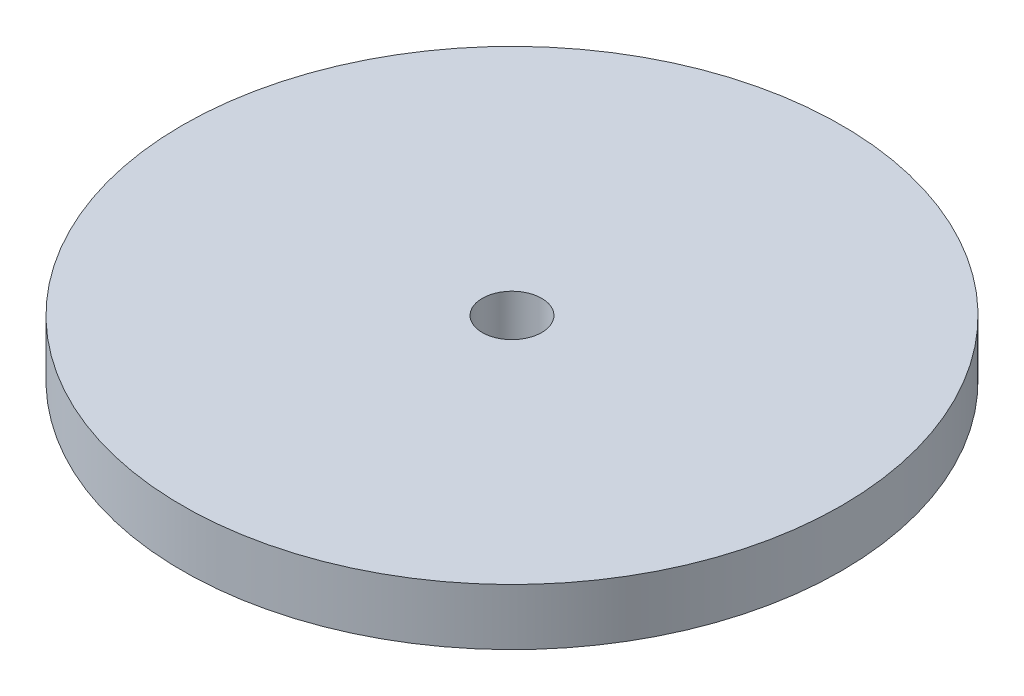
ISO-10303-21;
HEADER;
FILE_DESCRIPTION(('STEP AP214'),'2;1');
FILE_NAME('part.step','',(''),(''),'','','');
FILE_SCHEMA(('AUTOMOTIVE_DESIGN { 1 0 10303 214 1 1 1 1 }'));
ENDSEC;
DATA;
#1=APPLICATION_CONTEXT('core data for automotive mechanical design processes');
#2=APPLICATION_PROTOCOL_DEFINITION('international standard','automotive_design',2000,#1);
#3=PRODUCT_CONTEXT('',#1,'mechanical');
#4=PRODUCT('Part','Part','',(#3));
#5=PRODUCT_RELATED_PRODUCT_CATEGORY('part','',(#4));
#6=PRODUCT_DEFINITION_FORMATION('','',#4);
#7=PRODUCT_DEFINITION_CONTEXT('part definition',#1,'design');
#8=PRODUCT_DEFINITION('design','',#6,#7);
#9=PRODUCT_DEFINITION_SHAPE('','',#8);
#10=(LENGTH_UNIT() NAMED_UNIT(*) SI_UNIT(.MILLI.,.METRE.));
#11=(NAMED_UNIT(*) PLANE_ANGLE_UNIT() SI_UNIT($,.RADIAN.));
#12=(NAMED_UNIT(*) SI_UNIT($,.STERADIAN.) SOLID_ANGLE_UNIT());
#13=UNCERTAINTY_MEASURE_WITH_UNIT(LENGTH_MEASURE(1.E-05),#10,'distance_accuracy_value','');
#14=(GEOMETRIC_REPRESENTATION_CONTEXT(3) GLOBAL_UNCERTAINTY_ASSIGNED_CONTEXT((#13)) GLOBAL_UNIT_ASSIGNED_CONTEXT((#10,
#11,#12)) REPRESENTATION_CONTEXT('',''));
#15=CARTESIAN_POINT('',(0.,0.,0.));
#16=DIRECTION('',(0.,0.,1.));
#17=DIRECTION('',(1.,0.,0.));
#18=AXIS2_PLACEMENT_3D('',#15,#16,#17);
#19=CARTESIAN_POINT('',(-43.,817.,-1.62382802516847E-13));
#20=DIRECTION('',(0.,1.,0.));
#21=DIRECTION('',(-1.,0.,0.));
#22=AXIS2_PLACEMENT_3D('',#19,#20,#21);
#23=PLANE('',#22);
#24=CARTESIAN_POINT('',(-43.,817.,-1.68995676827488E-13));
#25=DIRECTION('',(0.,1.,0.));
#26=DIRECTION('',(-1.,0.,0.));
#27=AXIS2_PLACEMENT_3D('',#24,#25,#26);
#28=CIRCLE('',#27,10.);
#29=CARTESIAN_POINT('',(-53.,817.,-1.68995676827488E-13));
#30=VERTEX_POINT('',#29);
#31=EDGE_CURVE('E27',#30,#30,#28,.T.);
#32=ORIENTED_EDGE('',*,*,#31,.F.);
#33=EDGE_LOOP('',(#32));
#34=FACE_BOUND('',#33,.T.);
#35=CARTESIAN_POINT('',(-43.,817.,-1.62382802516847E-13));
#36=DIRECTION('',(0.,1.,0.));
#37=DIRECTION('',(-1.,0.,0.));
#38=AXIS2_PLACEMENT_3D('',#35,#36,#37);
#39=CIRCLE('',#38,111.);
#40=CARTESIAN_POINT('',(-154.,817.,-1.62382802516847E-13));
#41=VERTEX_POINT('',#40);
#42=EDGE_CURVE('E23',#41,#41,#39,.T.);
#43=ORIENTED_EDGE('',*,*,#42,.T.);
#44=EDGE_LOOP('',(#43));
#45=FACE_BOUND('',#44,.T.);
#46=ADVANCED_FACE('F15',(#34,#45),#23,.T.);
#47=CARTESIAN_POINT('',(-43.,798.,-1.62382802516847E-13));
#48=DIRECTION('',(0.,1.,0.));
#49=DIRECTION('',(-1.,0.,0.));
#50=AXIS2_PLACEMENT_3D('',#47,#48,#49);
#51=PLANE('',#50);
#52=CARTESIAN_POINT('',(-43.,798.,-1.68995676827488E-13));
#53=DIRECTION('',(0.,1.,0.));
#54=DIRECTION('',(-1.,0.,0.));
#55=AXIS2_PLACEMENT_3D('',#52,#53,#54);
#56=CIRCLE('',#55,10.);
#57=CARTESIAN_POINT('',(-53.,798.,-1.68995676827488E-13));
#58=VERTEX_POINT('',#57);
#59=EDGE_CURVE('E19',#58,#58,#56,.T.);
#60=ORIENTED_EDGE('',*,*,#59,.T.);
#61=EDGE_LOOP('',(#60));
#62=FACE_BOUND('',#61,.T.);
#63=CARTESIAN_POINT('',(-43.,798.,-1.62382802516847E-13));
#64=DIRECTION('',(0.,1.,0.));
#65=DIRECTION('',(-1.,0.,0.));
#66=AXIS2_PLACEMENT_3D('',#63,#64,#65);
#67=CIRCLE('',#66,111.);
#68=CARTESIAN_POINT('',(-154.,798.,-1.62382802516847E-13));
#69=VERTEX_POINT('',#68);
#70=EDGE_CURVE('E10',#69,#69,#67,.T.);
#71=ORIENTED_EDGE('',*,*,#70,.F.);
#72=EDGE_LOOP('',(#71));
#73=FACE_BOUND('',#72,.T.);
#74=ADVANCED_FACE('F17',(#62,#73),#51,.F.);
#75=CARTESIAN_POINT('',(-43.,798.,-1.62382802516847E-13));
#76=DIRECTION('',(0.,1.,0.));
#77=DIRECTION('',(-1.,0.,0.));
#78=AXIS2_PLACEMENT_3D('',#75,#76,#77);
#79=CYLINDRICAL_SURFACE('',#78,111.);
#80=ORIENTED_EDGE('',*,*,#42,.F.);
#81=EDGE_LOOP('',(#80));
#82=FACE_BOUND('',#81,.T.);
#83=ORIENTED_EDGE('',*,*,#70,.T.);
#84=EDGE_LOOP('',(#83));
#85=FACE_BOUND('',#84,.T.);
#86=ADVANCED_FACE('F40',(#82,#85),#79,.T.);
#87=CARTESIAN_POINT('',(-43.,168.940384383167,-1.68995676827488E-13));
#88=DIRECTION('',(0.,1.,0.));
#89=DIRECTION('',(-1.,0.,0.));
#90=AXIS2_PLACEMENT_3D('',#87,#88,#89);
#91=CYLINDRICAL_SURFACE('',#90,10.);
#92=ORIENTED_EDGE('',*,*,#31,.T.);
#93=EDGE_LOOP('',(#92));
#94=FACE_BOUND('',#93,.T.);
#95=ORIENTED_EDGE('',*,*,#59,.F.);
#96=EDGE_LOOP('',(#95));
#97=FACE_BOUND('',#96,.T.);
#98=ADVANCED_FACE('F38',(#94,#97),#91,.F.);
#99=CLOSED_SHELL('',(#46,#74,#86,#98));
#100=MANIFOLD_SOLID_BREP('B1',#99);
#101=ADVANCED_BREP_SHAPE_REPRESENTATION('',(#18,#100),#14);
#102=SHAPE_DEFINITION_REPRESENTATION(#9,#101);
ENDSEC;
END-ISO-10303-21;
